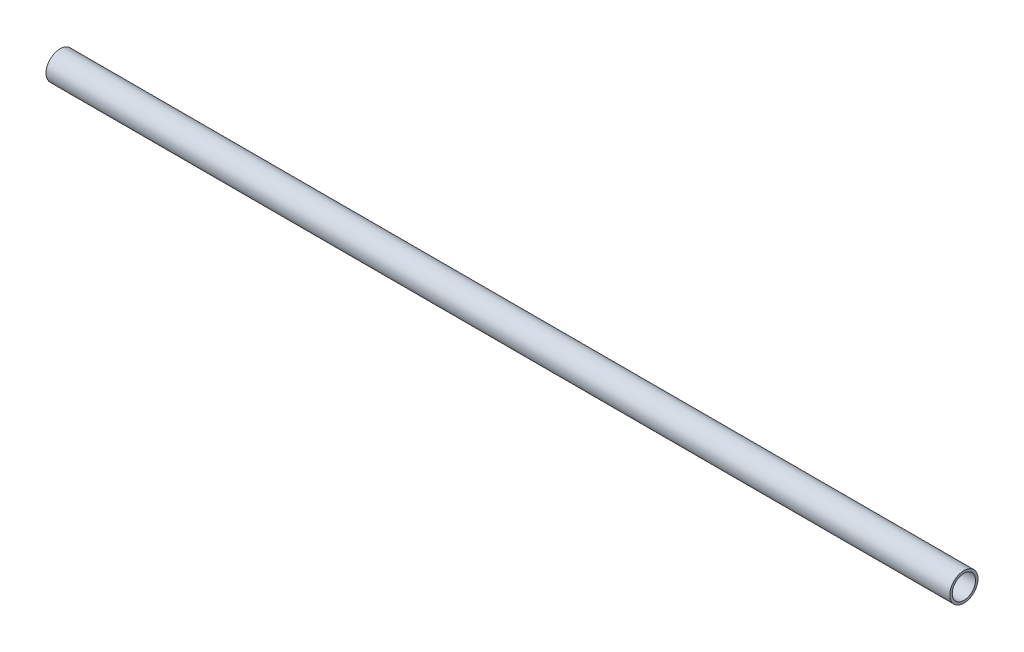
ISO-10303-21;
HEADER;
FILE_DESCRIPTION(('STEP AP214'),'2;1');
FILE_NAME('part.step','',(''),(''),'','','');
FILE_SCHEMA(('AUTOMOTIVE_DESIGN { 1 0 10303 214 1 1 1 1 }'));
ENDSEC;
DATA;
#1=APPLICATION_CONTEXT('core data for automotive mechanical design processes');
#2=APPLICATION_PROTOCOL_DEFINITION('international standard','automotive_design',2000,#1);
#3=PRODUCT_CONTEXT('',#1,'mechanical');
#4=PRODUCT('Part','Part','',(#3));
#5=PRODUCT_RELATED_PRODUCT_CATEGORY('part','',(#4));
#6=PRODUCT_DEFINITION_FORMATION('','',#4);
#7=PRODUCT_DEFINITION_CONTEXT('part definition',#1,'design');
#8=PRODUCT_DEFINITION('design','',#6,#7);
#9=PRODUCT_DEFINITION_SHAPE('','',#8);
#10=(LENGTH_UNIT() NAMED_UNIT(*) SI_UNIT(.MILLI.,.METRE.));
#11=(NAMED_UNIT(*) PLANE_ANGLE_UNIT() SI_UNIT($,.RADIAN.));
#12=(NAMED_UNIT(*) SI_UNIT($,.STERADIAN.) SOLID_ANGLE_UNIT());
#13=UNCERTAINTY_MEASURE_WITH_UNIT(LENGTH_MEASURE(1.E-05),#10,'distance_accuracy_value','');
#14=(GEOMETRIC_REPRESENTATION_CONTEXT(3) GLOBAL_UNCERTAINTY_ASSIGNED_CONTEXT((#13)) GLOBAL_UNIT_ASSIGNED_CONTEXT((#10,
#11,#12)) REPRESENTATION_CONTEXT('',''));
#15=CARTESIAN_POINT('',(0.,0.,0.));
#16=DIRECTION('',(0.,0.,1.));
#17=DIRECTION('',(1.,0.,0.));
#18=AXIS2_PLACEMENT_3D('',#15,#16,#17);
#19=CARTESIAN_POINT('',(304.8,0.,0.));
#20=DIRECTION('',(1.,0.,0.));
#21=DIRECTION('',(0.,0.,-1.));
#22=AXIS2_PLACEMENT_3D('',#19,#20,#21);
#23=PLANE('',#22);
#24=CARTESIAN_POINT('',(304.8,0.,0.));
#25=DIRECTION('',(1.,0.,0.));
#26=DIRECTION('',(0.,0.,-1.));
#27=AXIS2_PLACEMENT_3D('',#24,#25,#26);
#28=CIRCLE('',#27,9.525);
#29=CARTESIAN_POINT('',(304.8,0.,9.525));
#30=VERTEX_POINT('',#29);
#31=EDGE_CURVE('E10',#30,#30,#28,.T.);
#32=ORIENTED_EDGE('',*,*,#31,.T.);
#33=EDGE_LOOP('',(#32));
#34=FACE_BOUND('',#33,.T.);
#35=CARTESIAN_POINT('',(304.8,0.,0.));
#36=DIRECTION('',(1.,0.,0.));
#37=DIRECTION('',(0.,0.,-1.));
#38=AXIS2_PLACEMENT_3D('',#35,#36,#37);
#39=CIRCLE('',#38,7.874);
#40=CARTESIAN_POINT('',(304.8,0.,7.874));
#41=VERTEX_POINT('',#40);
#42=EDGE_CURVE('E39',#41,#41,#39,.T.);
#43=ORIENTED_EDGE('',*,*,#42,.F.);
#44=EDGE_LOOP('',(#43));
#45=FACE_BOUND('',#44,.T.);
#46=ADVANCED_FACE('F28',(#34,#45),#23,.T.);
#47=CARTESIAN_POINT('',(-304.8,0.,0.));
#48=DIRECTION('',(1.,0.,0.));
#49=DIRECTION('',(0.,0.,-1.));
#50=AXIS2_PLACEMENT_3D('',#47,#48,#49);
#51=PLANE('',#50);
#52=CARTESIAN_POINT('',(-304.8,0.,0.));
#53=DIRECTION('',(1.,0.,0.));
#54=DIRECTION('',(0.,0.,-1.));
#55=AXIS2_PLACEMENT_3D('',#52,#53,#54);
#56=CIRCLE('',#55,9.525);
#57=CARTESIAN_POINT('',(-304.8,0.,9.525));
#58=VERTEX_POINT('',#57);
#59=EDGE_CURVE('E32',#58,#58,#56,.T.);
#60=ORIENTED_EDGE('',*,*,#59,.F.);
#61=EDGE_LOOP('',(#60));
#62=FACE_BOUND('',#61,.T.);
#63=CARTESIAN_POINT('',(-304.8,0.,0.));
#64=DIRECTION('',(1.,0.,0.));
#65=DIRECTION('',(0.,0.,-1.));
#66=AXIS2_PLACEMENT_3D('',#63,#64,#65);
#67=CIRCLE('',#66,7.874);
#68=CARTESIAN_POINT('',(-304.8,0.,7.874));
#69=VERTEX_POINT('',#68);
#70=EDGE_CURVE('E41',#69,#69,#67,.T.);
#71=ORIENTED_EDGE('',*,*,#70,.T.);
#72=EDGE_LOOP('',(#71));
#73=FACE_BOUND('',#72,.T.);
#74=ADVANCED_FACE('F51',(#62,#73),#51,.F.);
#75=CARTESIAN_POINT('',(304.8,0.,0.));
#76=DIRECTION('',(-1.,0.,0.));
#77=DIRECTION('',(0.,0.,1.));
#78=AXIS2_PLACEMENT_3D('',#75,#76,#77);
#79=CYLINDRICAL_SURFACE('',#78,9.525);
#80=CARTESIAN_POINT('',(304.8,0.,9.525));
#81=CARTESIAN_POINT('',(298.45,0.,9.525));
#82=CARTESIAN_POINT('',(292.1,0.,9.525));
#83=CARTESIAN_POINT('',(279.4,0.,9.525));
#84=CARTESIAN_POINT('',(273.05,0.,9.525));
#85=CARTESIAN_POINT('',(260.35,0.,9.525));
#86=CARTESIAN_POINT('',(254.,0.,9.525));
#87=CARTESIAN_POINT('',(241.3,0.,9.525));
#88=CARTESIAN_POINT('',(234.95,0.,9.525));
#89=CARTESIAN_POINT('',(222.25,0.,9.525));
#90=CARTESIAN_POINT('',(215.9,0.,9.525));
#91=CARTESIAN_POINT('',(203.2,0.,9.525));
#92=CARTESIAN_POINT('',(196.85,0.,9.525));
#93=CARTESIAN_POINT('',(184.15,0.,9.525));
#94=CARTESIAN_POINT('',(177.8,0.,9.525));
#95=CARTESIAN_POINT('',(165.1,0.,9.525));
#96=CARTESIAN_POINT('',(158.75,0.,9.525));
#97=CARTESIAN_POINT('',(146.05,0.,9.525));
#98=CARTESIAN_POINT('',(139.7,0.,9.525));
#99=CARTESIAN_POINT('',(127.,0.,9.525));
#100=CARTESIAN_POINT('',(120.65,0.,9.525));
#101=CARTESIAN_POINT('',(107.95,0.,9.525));
#102=CARTESIAN_POINT('',(101.6,0.,9.525));
#103=CARTESIAN_POINT('',(88.9,0.,9.525));
#104=CARTESIAN_POINT('',(82.55,0.,9.525));
#105=CARTESIAN_POINT('',(69.85,0.,9.525));
#106=CARTESIAN_POINT('',(63.5,0.,9.525));
#107=CARTESIAN_POINT('',(50.8,0.,9.525));
#108=CARTESIAN_POINT('',(44.45,0.,9.525));
#109=CARTESIAN_POINT('',(31.75,0.,9.525));
#110=CARTESIAN_POINT('',(25.4,0.,9.525));
#111=CARTESIAN_POINT('',(12.7,0.,9.525));
#112=CARTESIAN_POINT('',(6.34999999999995,0.,9.525));
#113=CARTESIAN_POINT('',(-6.35000000000006,0.,9.525));
#114=CARTESIAN_POINT('',(-12.7000000000001,0.,9.525));
#115=CARTESIAN_POINT('',(-25.4000000000001,0.,9.525));
#116=CARTESIAN_POINT('',(-31.7500000000001,0.,9.525));
#117=CARTESIAN_POINT('',(-44.4500000000001,0.,9.525));
#118=CARTESIAN_POINT('',(-50.8000000000001,0.,9.525));
#119=CARTESIAN_POINT('',(-63.5000000000001,0.,9.525));
#120=CARTESIAN_POINT('',(-69.8500000000001,0.,9.525));
#121=CARTESIAN_POINT('',(-82.5500000000001,0.,9.525));
#122=CARTESIAN_POINT('',(-88.9000000000001,0.,9.525));
#123=CARTESIAN_POINT('',(-101.6,0.,9.525));
#124=CARTESIAN_POINT('',(-107.95,0.,9.525));
#125=CARTESIAN_POINT('',(-120.65,0.,9.525));
#126=CARTESIAN_POINT('',(-127.,0.,9.525));
#127=CARTESIAN_POINT('',(-139.7,0.,9.525));
#128=CARTESIAN_POINT('',(-146.05,0.,9.525));
#129=CARTESIAN_POINT('',(-158.75,0.,9.525));
#130=CARTESIAN_POINT('',(-165.1,0.,9.525));
#131=CARTESIAN_POINT('',(-177.8,0.,9.525));
#132=CARTESIAN_POINT('',(-184.15,0.,9.525));
#133=CARTESIAN_POINT('',(-196.85,0.,9.525));
#134=CARTESIAN_POINT('',(-203.2,0.,9.525));
#135=CARTESIAN_POINT('',(-215.9,0.,9.525));
#136=CARTESIAN_POINT('',(-222.25,0.,9.525));
#137=CARTESIAN_POINT('',(-234.95,0.,9.525));
#138=CARTESIAN_POINT('',(-241.3,0.,9.525));
#139=CARTESIAN_POINT('',(-254.,0.,9.525));
#140=CARTESIAN_POINT('',(-260.35,0.,9.525));
#141=CARTESIAN_POINT('',(-273.05,0.,9.525));
#142=CARTESIAN_POINT('',(-279.4,0.,9.525));
#143=CARTESIAN_POINT('',(-292.1,0.,9.525));
#144=CARTESIAN_POINT('',(-298.45,0.,9.525));
#145=CARTESIAN_POINT('',(-304.8,0.,9.525));
#146=B_SPLINE_CURVE_WITH_KNOTS('',3,(#80,#81,#82,#83,#84,#85,#86,#87,#88,#89,#90,#91,#92,#93,
#94,#95,#96,#97,#98,#99,#100,#101,#102,#103,#104,#105,#106,#107,#108,#109,#110,#111,#112,#113,
#114,#115,#116,#117,#118,#119,#120,#121,#122,#123,#124,#125,#126,#127,#128,#129,#130,#131,#132,
#133,#134,#135,#136,#137,#138,#139,#140,#141,#142,#143,#144,#145),.UNSPECIFIED.,.F.,.F.,(4,2,2,
2,2,2,2,2,2,2,2,2,2,2,2,2,2,2,2,2,2,2,2,2,2,2,2,2,2,2,2,2,4),(0.,19.05,38.1,57.15,76.2,95.25,
114.3,133.35,152.4,171.45,190.5,209.55,228.6,247.65,266.7,285.75,304.8,323.85,342.9,361.95,381.,
400.05,419.1,438.15,457.2,476.25,495.3,514.35,533.4,552.45,571.5,590.55,609.6),.UNSPECIFIED.);
#147=EDGE_CURVE('BSEAM30',#30,#58,#146,.T.);
#148=ORIENTED_EDGE('',*,*,#31,.F.);
#149=ORIENTED_EDGE('',*,*,#59,.T.);
#150=ORIENTED_EDGE('',*,*,#147,.T.);
#151=ORIENTED_EDGE('',*,*,#147,.F.);
#152=EDGE_LOOP('',(#148,#150,#149,#151));
#153=FACE_BOUND('',#152,.T.);
#154=ADVANCED_FACE('F30',(#153),#79,.T.);
#155=CARTESIAN_POINT('',(304.8,0.,0.));
#156=DIRECTION('',(-1.,0.,0.));
#157=DIRECTION('',(0.,0.,1.));
#158=AXIS2_PLACEMENT_3D('',#155,#156,#157);
#159=CYLINDRICAL_SURFACE('',#158,7.874);
#160=CARTESIAN_POINT('',(304.8,0.,7.874));
#161=CARTESIAN_POINT('',(298.45,0.,7.874));
#162=CARTESIAN_POINT('',(292.1,0.,7.874));
#163=CARTESIAN_POINT('',(279.4,0.,7.874));
#164=CARTESIAN_POINT('',(273.05,0.,7.874));
#165=CARTESIAN_POINT('',(260.35,0.,7.874));
#166=CARTESIAN_POINT('',(254.,0.,7.874));
#167=CARTESIAN_POINT('',(241.3,0.,7.874));
#168=CARTESIAN_POINT('',(234.95,0.,7.874));
#169=CARTESIAN_POINT('',(222.25,0.,7.874));
#170=CARTESIAN_POINT('',(215.9,0.,7.874));
#171=CARTESIAN_POINT('',(203.2,0.,7.874));
#172=CARTESIAN_POINT('',(196.85,0.,7.874));
#173=CARTESIAN_POINT('',(184.15,0.,7.874));
#174=CARTESIAN_POINT('',(177.8,0.,7.874));
#175=CARTESIAN_POINT('',(165.1,0.,7.874));
#176=CARTESIAN_POINT('',(158.75,0.,7.874));
#177=CARTESIAN_POINT('',(146.05,0.,7.874));
#178=CARTESIAN_POINT('',(139.7,0.,7.874));
#179=CARTESIAN_POINT('',(127.,0.,7.874));
#180=CARTESIAN_POINT('',(120.65,0.,7.874));
#181=CARTESIAN_POINT('',(107.95,0.,7.874));
#182=CARTESIAN_POINT('',(101.6,0.,7.874));
#183=CARTESIAN_POINT('',(88.9,0.,7.874));
#184=CARTESIAN_POINT('',(82.55,0.,7.874));
#185=CARTESIAN_POINT('',(69.85,0.,7.874));
#186=CARTESIAN_POINT('',(63.5,0.,7.874));
#187=CARTESIAN_POINT('',(50.8,0.,7.874));
#188=CARTESIAN_POINT('',(44.45,0.,7.874));
#189=CARTESIAN_POINT('',(31.75,0.,7.874));
#190=CARTESIAN_POINT('',(25.4,0.,7.874));
#191=CARTESIAN_POINT('',(12.7,0.,7.874));
#192=CARTESIAN_POINT('',(6.35,0.,7.874));
#193=CARTESIAN_POINT('',(-6.35,0.,7.874));
#194=CARTESIAN_POINT('',(-12.7,0.,7.874));
#195=CARTESIAN_POINT('',(-25.4,0.,7.874));
#196=CARTESIAN_POINT('',(-31.75,0.,7.874));
#197=CARTESIAN_POINT('',(-44.45,0.,7.874));
#198=CARTESIAN_POINT('',(-50.8,0.,7.874));
#199=CARTESIAN_POINT('',(-63.5,0.,7.874));
#200=CARTESIAN_POINT('',(-69.85,0.,7.874));
#201=CARTESIAN_POINT('',(-82.55,0.,7.874));
#202=CARTESIAN_POINT('',(-88.9,0.,7.874));
#203=CARTESIAN_POINT('',(-101.6,0.,7.874));
#204=CARTESIAN_POINT('',(-107.95,0.,7.874));
#205=CARTESIAN_POINT('',(-120.65,0.,7.874));
#206=CARTESIAN_POINT('',(-127.,0.,7.874));
#207=CARTESIAN_POINT('',(-139.7,0.,7.874));
#208=CARTESIAN_POINT('',(-146.05,0.,7.874));
#209=CARTESIAN_POINT('',(-158.75,0.,7.874));
#210=CARTESIAN_POINT('',(-165.1,0.,7.874));
#211=CARTESIAN_POINT('',(-177.8,0.,7.874));
#212=CARTESIAN_POINT('',(-184.15,0.,7.874));
#213=CARTESIAN_POINT('',(-196.85,0.,7.874));
#214=CARTESIAN_POINT('',(-203.2,0.,7.874));
#215=CARTESIAN_POINT('',(-215.9,0.,7.874));
#216=CARTESIAN_POINT('',(-222.25,0.,7.874));
#217=CARTESIAN_POINT('',(-234.95,0.,7.874));
#218=CARTESIAN_POINT('',(-241.3,0.,7.874));
#219=CARTESIAN_POINT('',(-254.,0.,7.874));
#220=CARTESIAN_POINT('',(-260.35,0.,7.874));
#221=CARTESIAN_POINT('',(-273.05,0.,7.874));
#222=CARTESIAN_POINT('',(-279.4,0.,7.874));
#223=CARTESIAN_POINT('',(-292.1,0.,7.874));
#224=CARTESIAN_POINT('',(-298.45,0.,7.874));
#225=CARTESIAN_POINT('',(-304.8,0.,7.874));
#226=B_SPLINE_CURVE_WITH_KNOTS('',3,(#160,#161,#162,#163,#164,#165,#166,#167,#168,#169,#170,
#171,#172,#173,#174,#175,#176,#177,#178,#179,#180,#181,#182,#183,#184,#185,#186,#187,#188,#189,
#190,#191,#192,#193,#194,#195,#196,#197,#198,#199,#200,#201,#202,#203,#204,#205,#206,#207,#208,
#209,#210,#211,#212,#213,#214,#215,#216,#217,#218,#219,#220,#221,#222,#223,#224,#225),
.UNSPECIFIED.,.F.,.F.,(4,2,2,2,2,2,2,2,2,2,2,2,2,2,2,2,2,2,2,2,2,2,2,2,2,2,2,2,2,2,2,2,4),(0.,
19.05,38.1,57.15,76.2,95.2500000000001,114.3,133.35,152.4,171.45,190.5,209.55,228.6,247.65,
266.7,285.75,304.8,323.85,342.9,361.95,381.,400.05,419.1,438.15,457.2,476.25,495.3,514.35,533.4,
552.45,571.5,590.55,609.6),.UNSPECIFIED.);
#227=EDGE_CURVE('BSEAM47',#41,#69,#226,.T.);
#228=ORIENTED_EDGE('',*,*,#42,.T.);
#229=ORIENTED_EDGE('',*,*,#70,.F.);
#230=ORIENTED_EDGE('',*,*,#227,.T.);
#231=ORIENTED_EDGE('',*,*,#227,.F.);
#232=EDGE_LOOP('',(#228,#230,#229,#231));
#233=FACE_BOUND('',#232,.T.);
#234=ADVANCED_FACE('F47',(#233),#159,.F.);
#235=CLOSED_SHELL('',(#46,#74,#154,#234));
#236=MANIFOLD_SOLID_BREP('B2',#235);
#237=ADVANCED_BREP_SHAPE_REPRESENTATION('',(#18,#236),#14);
#238=SHAPE_DEFINITION_REPRESENTATION(#9,#237);
ENDSEC;
END-ISO-10303-21;
